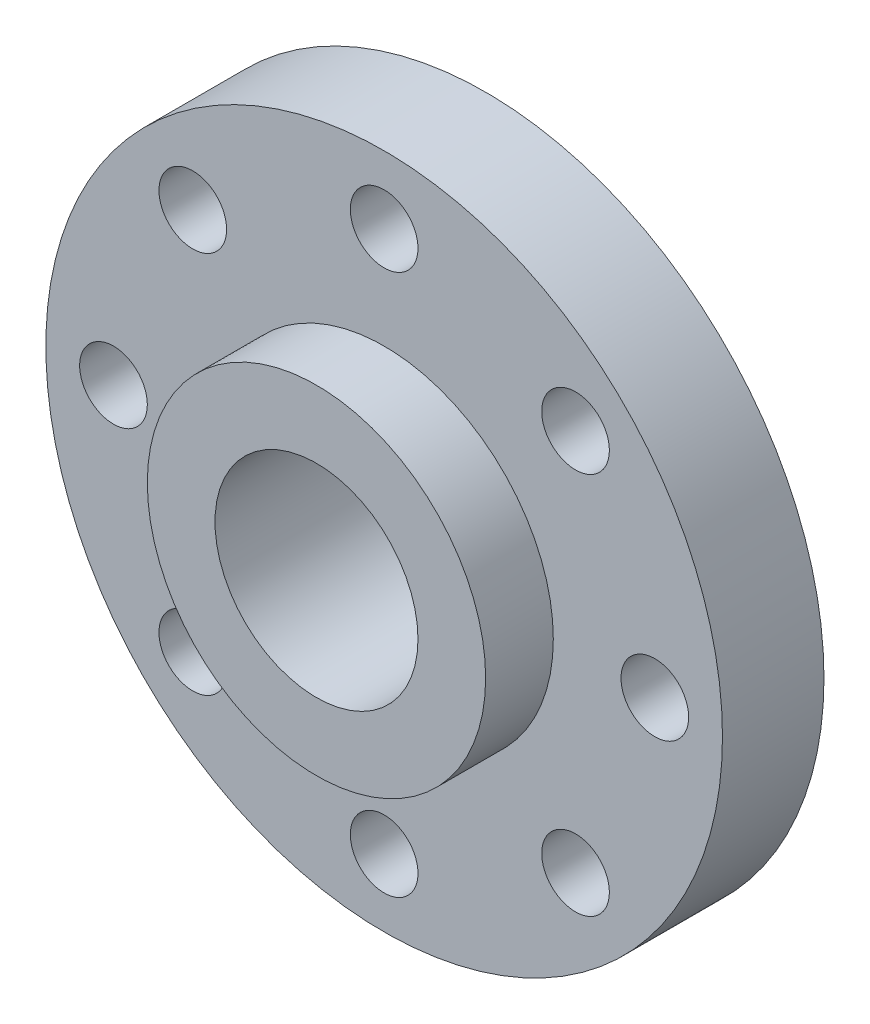
ISO-10303-21;
HEADER;
FILE_DESCRIPTION(('STEP AP214'),'2;1');
FILE_NAME('part.step','',(''),(''),'','','');
FILE_SCHEMA(('AUTOMOTIVE_DESIGN { 1 0 10303 214 1 1 1 1 }'));
ENDSEC;
DATA;
#1=APPLICATION_CONTEXT('core data for automotive mechanical design processes');
#2=APPLICATION_PROTOCOL_DEFINITION('international standard','automotive_design',2000,#1);
#3=PRODUCT_CONTEXT('',#1,'mechanical');
#4=PRODUCT('Part','Part','',(#3));
#5=PRODUCT_RELATED_PRODUCT_CATEGORY('part','',(#4));
#6=PRODUCT_DEFINITION_FORMATION('','',#4);
#7=PRODUCT_DEFINITION_CONTEXT('part definition',#1,'design');
#8=PRODUCT_DEFINITION('design','',#6,#7);
#9=PRODUCT_DEFINITION_SHAPE('','',#8);
#10=(LENGTH_UNIT() NAMED_UNIT(*) SI_UNIT(.MILLI.,.METRE.));
#11=(NAMED_UNIT(*) PLANE_ANGLE_UNIT() SI_UNIT($,.RADIAN.));
#12=(NAMED_UNIT(*) SI_UNIT($,.STERADIAN.) SOLID_ANGLE_UNIT());
#13=UNCERTAINTY_MEASURE_WITH_UNIT(LENGTH_MEASURE(1.E-05),#10,'distance_accuracy_value','');
#14=(GEOMETRIC_REPRESENTATION_CONTEXT(3) GLOBAL_UNCERTAINTY_ASSIGNED_CONTEXT((#13)) GLOBAL_UNIT_ASSIGNED_CONTEXT((#10,
#11,#12)) REPRESENTATION_CONTEXT('',''));
#15=CARTESIAN_POINT('',(0.,0.,0.));
#16=DIRECTION('',(0.,0.,1.));
#17=DIRECTION('',(1.,0.,0.));
#18=AXIS2_PLACEMENT_3D('',#15,#16,#17);
#19=CARTESIAN_POINT('',(0.,0.,3.));
#20=DIRECTION('',(0.,0.,-1.));
#21=DIRECTION('',(-1.,0.,0.));
#22=AXIS2_PLACEMENT_3D('',#19,#20,#21);
#23=CYLINDRICAL_SURFACE('',#22,10.);
#24=CARTESIAN_POINT('',(0.,0.,3.));
#25=DIRECTION('',(0.,0.,1.));
#26=DIRECTION('',(1.,0.,0.));
#27=AXIS2_PLACEMENT_3D('',#24,#25,#26);
#28=CIRCLE('',#27,10.);
#29=CARTESIAN_POINT('',(10.,0.,3.));
#30=VERTEX_POINT('',#29);
#31=EDGE_CURVE('E43',#30,#30,#28,.T.);
#32=ORIENTED_EDGE('',*,*,#31,.F.);
#33=EDGE_LOOP('',(#32));
#34=FACE_BOUND('',#33,.T.);
#35=CARTESIAN_POINT('',(0.,0.,0.));
#36=DIRECTION('',(0.,0.,1.));
#37=DIRECTION('',(1.,0.,0.));
#38=AXIS2_PLACEMENT_3D('',#35,#36,#37);
#39=CIRCLE('',#38,10.);
#40=CARTESIAN_POINT('',(10.,0.,0.));
#41=VERTEX_POINT('',#40);
#42=EDGE_CURVE('E39',#41,#41,#39,.T.);
#43=ORIENTED_EDGE('',*,*,#42,.T.);
#44=EDGE_LOOP('',(#43));
#45=FACE_BOUND('',#44,.T.);
#46=ADVANCED_FACE('F36',(#34,#45),#23,.T.);
#47=CARTESIAN_POINT('',(0.,0.,3.));
#48=DIRECTION('',(0.,0.,1.));
#49=DIRECTION('',(1.,0.,0.));
#50=AXIS2_PLACEMENT_3D('',#47,#48,#49);
#51=PLANE('',#50);
#52=CARTESIAN_POINT('',(0.,8.,3.));
#53=DIRECTION('',(0.,0.,1.));
#54=DIRECTION('',(1.,0.,0.));
#55=AXIS2_PLACEMENT_3D('',#52,#53,#54);
#56=CIRCLE('',#55,1.);
#57=CARTESIAN_POINT('',(1.,8.,3.));
#58=VERTEX_POINT('',#57);
#59=EDGE_CURVE('E96',#58,#58,#56,.T.);
#60=ORIENTED_EDGE('',*,*,#59,.F.);
#61=EDGE_LOOP('',(#60));
#62=FACE_BOUND('',#61,.T.);
#63=CARTESIAN_POINT('',(5.65685424949239,5.65685424949237,3.));
#64=DIRECTION('',(0.,0.,1.));
#65=DIRECTION('',(1.,0.,0.));
#66=AXIS2_PLACEMENT_3D('',#63,#64,#65);
#67=CIRCLE('',#66,1.);
#68=CARTESIAN_POINT('',(6.65685424949239,5.65685424949237,3.));
#69=VERTEX_POINT('',#68);
#70=EDGE_CURVE('E90',#69,#69,#67,.T.);
#71=ORIENTED_EDGE('',*,*,#70,.F.);
#72=EDGE_LOOP('',(#71));
#73=FACE_BOUND('',#72,.T.);
#74=CARTESIAN_POINT('',(8.00000000000023,2.25904099284255E-13,3.));
#75=DIRECTION('',(0.,0.,1.));
#76=DIRECTION('',(1.,0.,0.));
#77=AXIS2_PLACEMENT_3D('',#74,#75,#76);
#78=CIRCLE('',#77,1.00000000000018);
#79=CARTESIAN_POINT('',(9.00000000000041,2.25904099284255E-13,3.));
#80=VERTEX_POINT('',#79);
#81=EDGE_CURVE('E84',#80,#80,#78,.T.);
#82=ORIENTED_EDGE('',*,*,#81,.F.);
#83=EDGE_LOOP('',(#82));
#84=FACE_BOUND('',#83,.T.);
#85=CARTESIAN_POINT('',(5.65685424949277,-5.65685424949222,3.));
#86=DIRECTION('',(0.,0.,1.));
#87=DIRECTION('',(1.,0.,0.));
#88=AXIS2_PLACEMENT_3D('',#85,#86,#87);
#89=CIRCLE('',#88,1.00000000000036);
#90=CARTESIAN_POINT('',(6.65685424949313,-5.65685424949222,3.));
#91=VERTEX_POINT('',#90);
#92=EDGE_CURVE('E78',#91,#91,#89,.T.);
#93=ORIENTED_EDGE('',*,*,#92,.F.);
#94=EDGE_LOOP('',(#93));
#95=FACE_BOUND('',#94,.T.);
#96=CARTESIAN_POINT('',(4.5205312792834E-13,-8.,3.));
#97=DIRECTION('',(0.,0.,1.));
#98=DIRECTION('',(1.,0.,0.));
#99=AXIS2_PLACEMENT_3D('',#96,#97,#98);
#100=CIRCLE('',#99,1.00000000000049);
#101=CARTESIAN_POINT('',(1.00000000000094,-8.,3.));
#102=VERTEX_POINT('',#101);
#103=EDGE_CURVE('E72',#102,#102,#100,.T.);
#104=ORIENTED_EDGE('',*,*,#103,.F.);
#105=EDGE_LOOP('',(#104));
#106=FACE_BOUND('',#105,.T.);
#107=CARTESIAN_POINT('',(-5.656854249492,-5.65685424949254,3.));
#108=DIRECTION('',(0.,0.,1.));
#109=DIRECTION('',(1.,0.,0.));
#110=AXIS2_PLACEMENT_3D('',#107,#108,#109);
#111=CIRCLE('',#110,1.00000000000048);
#112=CARTESIAN_POINT('',(-4.65685424949151,-5.65685424949254,3.));
#113=VERTEX_POINT('',#112);
#114=EDGE_CURVE('E66',#113,#113,#111,.T.);
#115=ORIENTED_EDGE('',*,*,#114,.F.);
#116=EDGE_LOOP('',(#115));
#117=FACE_BOUND('',#116,.T.);
#118=CARTESIAN_POINT('',(-7.99999999999978,-2.26883816723573E-13,3.));
#119=DIRECTION('',(0.,0.,1.));
#120=DIRECTION('',(1.,0.,0.));
#121=AXIS2_PLACEMENT_3D('',#118,#119,#120);
#122=CIRCLE('',#121,1.00000000000036);
#123=CARTESIAN_POINT('',(-6.99999999999941,-2.26883816723573E-13,3.));
#124=VERTEX_POINT('',#123);
#125=EDGE_CURVE('E60',#124,#124,#122,.T.);
#126=ORIENTED_EDGE('',*,*,#125,.F.);
#127=EDGE_LOOP('',(#126));
#128=FACE_BOUND('',#127,.T.);
#129=CARTESIAN_POINT('',(-5.65685424949232,5.65685424949222,3.));
#130=DIRECTION('',(0.,0.,1.));
#131=DIRECTION('',(1.,0.,0.));
#132=AXIS2_PLACEMENT_3D('',#129,#130,#131);
#133=CIRCLE('',#132,1.00000000000021);
#134=CARTESIAN_POINT('',(-4.65685424949211,5.65685424949222,3.));
#135=VERTEX_POINT('',#134);
#136=EDGE_CURVE('E53',#135,#135,#133,.T.);
#137=ORIENTED_EDGE('',*,*,#136,.F.);
#138=EDGE_LOOP('',(#137));
#139=FACE_BOUND('',#138,.T.);
#140=CARTESIAN_POINT('',(0.,0.,3.));
#141=DIRECTION('',(0.,0.,1.));
#142=DIRECTION('',(1.,0.,0.));
#143=AXIS2_PLACEMENT_3D('',#140,#141,#142);
#144=CIRCLE('',#143,5.);
#145=CARTESIAN_POINT('',(5.,0.,3.));
#146=VERTEX_POINT('',#145);
#147=EDGE_CURVE('E10',#146,#146,#144,.T.);
#148=ORIENTED_EDGE('',*,*,#147,.F.);
#149=EDGE_LOOP('',(#148));
#150=FACE_BOUND('',#149,.T.);
#151=ORIENTED_EDGE('',*,*,#31,.T.);
#152=EDGE_LOOP('',(#151));
#153=FACE_BOUND('',#152,.T.);
#154=ADVANCED_FACE('F130',(#62,#73,#84,#95,#106,#117,#128,#139,#150,#153),#51,.T.);
#155=CARTESIAN_POINT('',(0.,0.,0.));
#156=DIRECTION('',(0.,0.,1.));
#157=DIRECTION('',(1.,0.,0.));
#158=AXIS2_PLACEMENT_3D('',#155,#156,#157);
#159=PLANE('',#158);
#160=CARTESIAN_POINT('',(0.,0.,0.));
#161=DIRECTION('',(0.,0.,1.));
#162=DIRECTION('',(1.,0.,0.));
#163=AXIS2_PLACEMENT_3D('',#160,#161,#162);
#164=CIRCLE('',#163,3.);
#165=CARTESIAN_POINT('',(3.,0.,0.));
#166=VERTEX_POINT('',#165);
#167=EDGE_CURVE('E57',#166,#166,#164,.T.);
#168=ORIENTED_EDGE('',*,*,#167,.T.);
#169=EDGE_LOOP('',(#168));
#170=FACE_BOUND('',#169,.T.);
#171=CARTESIAN_POINT('',(0.,8.,0.));
#172=DIRECTION('',(0.,0.,1.));
#173=DIRECTION('',(1.,0.,0.));
#174=AXIS2_PLACEMENT_3D('',#171,#172,#173);
#175=CIRCLE('',#174,1.);
#176=CARTESIAN_POINT('',(1.,8.,0.));
#177=VERTEX_POINT('',#176);
#178=EDGE_CURVE('E52',#177,#177,#175,.T.);
#179=ORIENTED_EDGE('',*,*,#178,.T.);
#180=EDGE_LOOP('',(#179));
#181=FACE_BOUND('',#180,.T.);
#182=CARTESIAN_POINT('',(5.65685424949239,5.65685424949237,0.));
#183=DIRECTION('',(0.,0.,1.));
#184=DIRECTION('',(1.,0.,0.));
#185=AXIS2_PLACEMENT_3D('',#182,#183,#184);
#186=CIRCLE('',#185,1.);
#187=CARTESIAN_POINT('',(6.65685424949239,5.65685424949237,0.));
#188=VERTEX_POINT('',#187);
#189=EDGE_CURVE('E93',#188,#188,#186,.T.);
#190=ORIENTED_EDGE('',*,*,#189,.T.);
#191=EDGE_LOOP('',(#190));
#192=FACE_BOUND('',#191,.T.);
#193=CARTESIAN_POINT('',(8.00000000000023,2.25904099284255E-13,0.));
#194=DIRECTION('',(0.,0.,1.));
#195=DIRECTION('',(1.,0.,0.));
#196=AXIS2_PLACEMENT_3D('',#193,#194,#195);
#197=CIRCLE('',#196,1.00000000000018);
#198=CARTESIAN_POINT('',(9.00000000000041,2.25904099284255E-13,0.));
#199=VERTEX_POINT('',#198);
#200=EDGE_CURVE('E87',#199,#199,#197,.T.);
#201=ORIENTED_EDGE('',*,*,#200,.T.);
#202=EDGE_LOOP('',(#201));
#203=FACE_BOUND('',#202,.T.);
#204=CARTESIAN_POINT('',(5.65685424949277,-5.65685424949222,0.));
#205=DIRECTION('',(0.,0.,1.));
#206=DIRECTION('',(1.,0.,0.));
#207=AXIS2_PLACEMENT_3D('',#204,#205,#206);
#208=CIRCLE('',#207,1.00000000000036);
#209=CARTESIAN_POINT('',(6.65685424949313,-5.65685424949222,0.));
#210=VERTEX_POINT('',#209);
#211=EDGE_CURVE('E81',#210,#210,#208,.T.);
#212=ORIENTED_EDGE('',*,*,#211,.T.);
#213=EDGE_LOOP('',(#212));
#214=FACE_BOUND('',#213,.T.);
#215=CARTESIAN_POINT('',(4.5205312792834E-13,-8.,0.));
#216=DIRECTION('',(0.,0.,1.));
#217=DIRECTION('',(1.,0.,0.));
#218=AXIS2_PLACEMENT_3D('',#215,#216,#217);
#219=CIRCLE('',#218,1.00000000000049);
#220=CARTESIAN_POINT('',(1.00000000000094,-8.,0.));
#221=VERTEX_POINT('',#220);
#222=EDGE_CURVE('E75',#221,#221,#219,.T.);
#223=ORIENTED_EDGE('',*,*,#222,.T.);
#224=EDGE_LOOP('',(#223));
#225=FACE_BOUND('',#224,.T.);
#226=CARTESIAN_POINT('',(-5.656854249492,-5.65685424949254,0.));
#227=DIRECTION('',(0.,0.,1.));
#228=DIRECTION('',(1.,0.,0.));
#229=AXIS2_PLACEMENT_3D('',#226,#227,#228);
#230=CIRCLE('',#229,1.00000000000048);
#231=CARTESIAN_POINT('',(-4.65685424949151,-5.65685424949254,0.));
#232=VERTEX_POINT('',#231);
#233=EDGE_CURVE('E69',#232,#232,#230,.T.);
#234=ORIENTED_EDGE('',*,*,#233,.T.);
#235=EDGE_LOOP('',(#234));
#236=FACE_BOUND('',#235,.T.);
#237=CARTESIAN_POINT('',(-7.99999999999978,-2.26883816723573E-13,0.));
#238=DIRECTION('',(0.,0.,1.));
#239=DIRECTION('',(1.,0.,0.));
#240=AXIS2_PLACEMENT_3D('',#237,#238,#239);
#241=CIRCLE('',#240,1.00000000000036);
#242=CARTESIAN_POINT('',(-6.99999999999941,-2.26883816723573E-13,0.));
#243=VERTEX_POINT('',#242);
#244=EDGE_CURVE('E63',#243,#243,#241,.T.);
#245=ORIENTED_EDGE('',*,*,#244,.T.);
#246=EDGE_LOOP('',(#245));
#247=FACE_BOUND('',#246,.T.);
#248=CARTESIAN_POINT('',(-5.65685424949232,5.65685424949222,0.));
#249=DIRECTION('',(0.,0.,1.));
#250=DIRECTION('',(1.,0.,0.));
#251=AXIS2_PLACEMENT_3D('',#248,#249,#250);
#252=CIRCLE('',#251,1.00000000000021);
#253=CARTESIAN_POINT('',(-4.65685424949211,5.65685424949222,0.));
#254=VERTEX_POINT('',#253);
#255=EDGE_CURVE('E56',#254,#254,#252,.T.);
#256=ORIENTED_EDGE('',*,*,#255,.T.);
#257=EDGE_LOOP('',(#256));
#258=FACE_BOUND('',#257,.T.);
#259=ORIENTED_EDGE('',*,*,#42,.F.);
#260=EDGE_LOOP('',(#259));
#261=FACE_BOUND('',#260,.T.);
#262=ADVANCED_FACE('F107',(#170,#181,#192,#203,#214,#225,#236,#247,#258,#261),#159,.F.);
#263=CARTESIAN_POINT('',(0.,0.,5.));
#264=DIRECTION('',(0.,0.,-1.));
#265=DIRECTION('',(-1.,0.,0.));
#266=AXIS2_PLACEMENT_3D('',#263,#264,#265);
#267=CYLINDRICAL_SURFACE('',#266,5.);
#268=CARTESIAN_POINT('',(0.,0.,5.));
#269=DIRECTION('',(0.,0.,1.));
#270=DIRECTION('',(1.,0.,0.));
#271=AXIS2_PLACEMENT_3D('',#268,#269,#270);
#272=CIRCLE('',#271,5.);
#273=CARTESIAN_POINT('',(5.,0.,5.));
#274=VERTEX_POINT('',#273);
#275=EDGE_CURVE('E49',#274,#274,#272,.T.);
#276=ORIENTED_EDGE('',*,*,#275,.F.);
#277=EDGE_LOOP('',(#276));
#278=FACE_BOUND('',#277,.T.);
#279=ORIENTED_EDGE('',*,*,#147,.T.);
#280=EDGE_LOOP('',(#279));
#281=FACE_BOUND('',#280,.T.);
#282=ADVANCED_FACE('F121',(#278,#281),#267,.T.);
#283=CARTESIAN_POINT('',(0.,0.,5.));
#284=DIRECTION('',(0.,0.,1.));
#285=DIRECTION('',(1.,0.,0.));
#286=AXIS2_PLACEMENT_3D('',#283,#284,#285);
#287=PLANE('',#286);
#288=CARTESIAN_POINT('',(0.,0.,5.));
#289=DIRECTION('',(0.,0.,1.));
#290=DIRECTION('',(1.,0.,0.));
#291=AXIS2_PLACEMENT_3D('',#288,#289,#290);
#292=CIRCLE('',#291,3.);
#293=CARTESIAN_POINT('',(3.,0.,5.));
#294=VERTEX_POINT('',#293);
#295=EDGE_CURVE('E101',#294,#294,#292,.T.);
#296=ORIENTED_EDGE('',*,*,#295,.F.);
#297=EDGE_LOOP('',(#296));
#298=FACE_BOUND('',#297,.T.);
#299=ORIENTED_EDGE('',*,*,#275,.T.);
#300=EDGE_LOOP('',(#299));
#301=FACE_BOUND('',#300,.T.);
#302=ADVANCED_FACE('F117',(#298,#301),#287,.T.);
#303=CARTESIAN_POINT('',(-5.65685424949232,5.65685424949222,0.));
#304=DIRECTION('',(0.,0.,1.));
#305=DIRECTION('',(1.,0.,0.));
#306=AXIS2_PLACEMENT_3D('',#303,#304,#305);
#307=CYLINDRICAL_SURFACE('',#306,1.00000000000021);
#308=ORIENTED_EDGE('',*,*,#255,.F.);
#309=EDGE_LOOP('',(#308));
#310=FACE_BOUND('',#309,.T.);
#311=ORIENTED_EDGE('',*,*,#136,.T.);
#312=EDGE_LOOP('',(#311));
#313=FACE_BOUND('',#312,.T.);
#314=ADVANCED_FACE('F120',(#310,#313),#307,.F.);
#315=CARTESIAN_POINT('',(-7.99999999999978,-2.26883816723573E-13,0.));
#316=DIRECTION('',(0.,0.,1.));
#317=DIRECTION('',(1.,0.,0.));
#318=AXIS2_PLACEMENT_3D('',#315,#316,#317);
#319=CYLINDRICAL_SURFACE('',#318,1.00000000000036);
#320=ORIENTED_EDGE('',*,*,#244,.F.);
#321=EDGE_LOOP('',(#320));
#322=FACE_BOUND('',#321,.T.);
#323=ORIENTED_EDGE('',*,*,#125,.T.);
#324=EDGE_LOOP('',(#323));
#325=FACE_BOUND('',#324,.T.);
#326=ADVANCED_FACE('F164',(#322,#325),#319,.F.);
#327=CARTESIAN_POINT('',(-5.656854249492,-5.65685424949254,0.));
#328=DIRECTION('',(0.,0.,1.));
#329=DIRECTION('',(1.,0.,0.));
#330=AXIS2_PLACEMENT_3D('',#327,#328,#329);
#331=CYLINDRICAL_SURFACE('',#330,1.00000000000048);
#332=ORIENTED_EDGE('',*,*,#233,.F.);
#333=EDGE_LOOP('',(#332));
#334=FACE_BOUND('',#333,.T.);
#335=ORIENTED_EDGE('',*,*,#114,.T.);
#336=EDGE_LOOP('',(#335));
#337=FACE_BOUND('',#336,.T.);
#338=ADVANCED_FACE('F170',(#334,#337),#331,.F.);
#339=CARTESIAN_POINT('',(4.5205312792834E-13,-8.,0.));
#340=DIRECTION('',(0.,0.,1.));
#341=DIRECTION('',(1.,0.,0.));
#342=AXIS2_PLACEMENT_3D('',#339,#340,#341);
#343=CYLINDRICAL_SURFACE('',#342,1.00000000000049);
#344=ORIENTED_EDGE('',*,*,#222,.F.);
#345=EDGE_LOOP('',(#344));
#346=FACE_BOUND('',#345,.T.);
#347=ORIENTED_EDGE('',*,*,#103,.T.);
#348=EDGE_LOOP('',(#347));
#349=FACE_BOUND('',#348,.T.);
#350=ADVANCED_FACE('F177',(#346,#349),#343,.F.);
#351=CARTESIAN_POINT('',(5.65685424949277,-5.65685424949222,0.));
#352=DIRECTION('',(0.,0.,1.));
#353=DIRECTION('',(1.,0.,0.));
#354=AXIS2_PLACEMENT_3D('',#351,#352,#353);
#355=CYLINDRICAL_SURFACE('',#354,1.00000000000036);
#356=ORIENTED_EDGE('',*,*,#211,.F.);
#357=EDGE_LOOP('',(#356));
#358=FACE_BOUND('',#357,.T.);
#359=ORIENTED_EDGE('',*,*,#92,.T.);
#360=EDGE_LOOP('',(#359));
#361=FACE_BOUND('',#360,.T.);
#362=ADVANCED_FACE('F181',(#358,#361),#355,.F.);
#363=CARTESIAN_POINT('',(8.00000000000023,2.25904099284255E-13,0.));
#364=DIRECTION('',(0.,0.,1.));
#365=DIRECTION('',(1.,0.,0.));
#366=AXIS2_PLACEMENT_3D('',#363,#364,#365);
#367=CYLINDRICAL_SURFACE('',#366,1.00000000000018);
#368=ORIENTED_EDGE('',*,*,#200,.F.);
#369=EDGE_LOOP('',(#368));
#370=FACE_BOUND('',#369,.T.);
#371=ORIENTED_EDGE('',*,*,#81,.T.);
#372=EDGE_LOOP('',(#371));
#373=FACE_BOUND('',#372,.T.);
#374=ADVANCED_FACE('F185',(#370,#373),#367,.F.);
#375=CARTESIAN_POINT('',(5.65685424949239,5.65685424949237,0.));
#376=DIRECTION('',(0.,0.,1.));
#377=DIRECTION('',(1.,0.,0.));
#378=AXIS2_PLACEMENT_3D('',#375,#376,#377);
#379=CYLINDRICAL_SURFACE('',#378,1.);
#380=ORIENTED_EDGE('',*,*,#189,.F.);
#381=EDGE_LOOP('',(#380));
#382=FACE_BOUND('',#381,.T.);
#383=ORIENTED_EDGE('',*,*,#70,.T.);
#384=EDGE_LOOP('',(#383));
#385=FACE_BOUND('',#384,.T.);
#386=ADVANCED_FACE('F189',(#382,#385),#379,.F.);
#387=CARTESIAN_POINT('',(0.,8.,0.));
#388=DIRECTION('',(0.,0.,1.));
#389=DIRECTION('',(1.,0.,0.));
#390=AXIS2_PLACEMENT_3D('',#387,#388,#389);
#391=CYLINDRICAL_SURFACE('',#390,1.);
#392=ORIENTED_EDGE('',*,*,#178,.F.);
#393=EDGE_LOOP('',(#392));
#394=FACE_BOUND('',#393,.T.);
#395=ORIENTED_EDGE('',*,*,#59,.T.);
#396=EDGE_LOOP('',(#395));
#397=FACE_BOUND('',#396,.T.);
#398=ADVANCED_FACE('F113',(#394,#397),#391,.F.);
#399=CARTESIAN_POINT('',(0.,0.,0.));
#400=DIRECTION('',(0.,0.,1.));
#401=DIRECTION('',(1.,0.,0.));
#402=AXIS2_PLACEMENT_3D('',#399,#400,#401);
#403=CYLINDRICAL_SURFACE('',#402,3.);
#404=ORIENTED_EDGE('',*,*,#167,.F.);
#405=EDGE_LOOP('',(#404));
#406=FACE_BOUND('',#405,.T.);
#407=ORIENTED_EDGE('',*,*,#295,.T.);
#408=EDGE_LOOP('',(#407));
#409=FACE_BOUND('',#408,.T.);
#410=ADVANCED_FACE('F110',(#406,#409),#403,.F.);
#411=CLOSED_SHELL('',(#46,#154,#262,#282,#302,#314,#326,#338,#350,#362,#374,#386,#398,#410));
#412=MANIFOLD_SOLID_BREP('B2',#411);
#413=ADVANCED_BREP_SHAPE_REPRESENTATION('',(#18,#412),#14);
#414=SHAPE_DEFINITION_REPRESENTATION(#9,#413);
ENDSEC;
END-ISO-10303-21;
